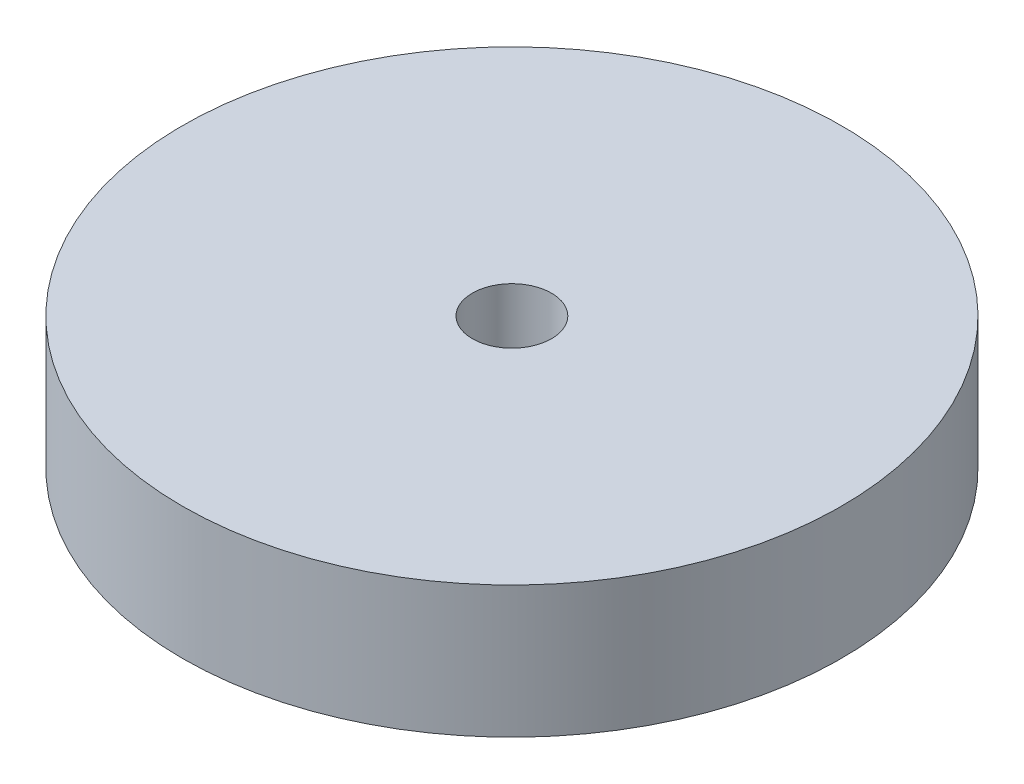
ISO-10303-21;
HEADER;
FILE_DESCRIPTION(('STEP AP214'),'2;1');
FILE_NAME('part.step','',(''),(''),'','','');
FILE_SCHEMA(('AUTOMOTIVE_DESIGN { 1 0 10303 214 1 1 1 1 }'));
ENDSEC;
DATA;
#1=APPLICATION_CONTEXT('core data for automotive mechanical design processes');
#2=APPLICATION_PROTOCOL_DEFINITION('international standard','automotive_design',2000,#1);
#3=PRODUCT_CONTEXT('',#1,'mechanical');
#4=PRODUCT('Part','Part','',(#3));
#5=PRODUCT_RELATED_PRODUCT_CATEGORY('part','',(#4));
#6=PRODUCT_DEFINITION_FORMATION('','',#4);
#7=PRODUCT_DEFINITION_CONTEXT('part definition',#1,'design');
#8=PRODUCT_DEFINITION('design','',#6,#7);
#9=PRODUCT_DEFINITION_SHAPE('','',#8);
#10=(LENGTH_UNIT() NAMED_UNIT(*) SI_UNIT(.MILLI.,.METRE.));
#11=(NAMED_UNIT(*) PLANE_ANGLE_UNIT() SI_UNIT($,.RADIAN.));
#12=(NAMED_UNIT(*) SI_UNIT($,.STERADIAN.) SOLID_ANGLE_UNIT());
#13=UNCERTAINTY_MEASURE_WITH_UNIT(LENGTH_MEASURE(1.E-05),#10,'distance_accuracy_value','');
#14=(GEOMETRIC_REPRESENTATION_CONTEXT(3) GLOBAL_UNCERTAINTY_ASSIGNED_CONTEXT((#13)) GLOBAL_UNIT_ASSIGNED_CONTEXT((#10,
#11,#12)) REPRESENTATION_CONTEXT('',''));
#15=CARTESIAN_POINT('',(0.,0.,0.));
#16=DIRECTION('',(0.,0.,1.));
#17=DIRECTION('',(1.,0.,0.));
#18=AXIS2_PLACEMENT_3D('',#15,#16,#17);
#19=CARTESIAN_POINT('',(0.,5.,0.));
#20=DIRECTION('',(0.,1.,0.));
#21=DIRECTION('',(0.,0.,1.));
#22=AXIS2_PLACEMENT_3D('',#19,#20,#21);
#23=PLANE('',#22);
#24=CARTESIAN_POINT('',(0.,5.,0.));
#25=DIRECTION('',(0.,1.,0.));
#26=DIRECTION('',(0.,0.,1.));
#27=AXIS2_PLACEMENT_3D('',#24,#25,#26);
#28=CIRCLE('',#27,25.);
#29=CARTESIAN_POINT('',(0.,5.,25.));
#30=VERTEX_POINT('',#29);
#31=EDGE_CURVE('E10',#30,#30,#28,.T.);
#32=ORIENTED_EDGE('',*,*,#31,.T.);
#33=EDGE_LOOP('',(#32));
#34=FACE_BOUND('',#33,.T.);
#35=CARTESIAN_POINT('',(0.,5.,0.));
#36=DIRECTION('',(0.,1.,0.));
#37=DIRECTION('',(0.,0.,1.));
#38=AXIS2_PLACEMENT_3D('',#35,#36,#37);
#39=CIRCLE('',#38,3.);
#40=CARTESIAN_POINT('',(0.,5.,3.));
#41=VERTEX_POINT('',#40);
#42=EDGE_CURVE('E46',#41,#41,#39,.T.);
#43=ORIENTED_EDGE('',*,*,#42,.F.);
#44=EDGE_LOOP('',(#43));
#45=FACE_BOUND('',#44,.T.);
#46=ADVANCED_FACE('F35',(#34,#45),#23,.T.);
#47=CARTESIAN_POINT('',(0.,-5.,0.));
#48=DIRECTION('',(0.,1.,0.));
#49=DIRECTION('',(0.,0.,1.));
#50=AXIS2_PLACEMENT_3D('',#47,#48,#49);
#51=PLANE('',#50);
#52=CARTESIAN_POINT('',(0.,-5.,0.));
#53=DIRECTION('',(0.,1.,0.));
#54=DIRECTION('',(0.,0.,1.));
#55=AXIS2_PLACEMENT_3D('',#52,#53,#54);
#56=CIRCLE('',#55,25.);
#57=CARTESIAN_POINT('',(0.,-5.,25.));
#58=VERTEX_POINT('',#57);
#59=EDGE_CURVE('E39',#58,#58,#56,.T.);
#60=ORIENTED_EDGE('',*,*,#59,.F.);
#61=EDGE_LOOP('',(#60));
#62=FACE_BOUND('',#61,.T.);
#63=CARTESIAN_POINT('',(0.,-5.,0.));
#64=DIRECTION('',(0.,1.,0.));
#65=DIRECTION('',(0.,0.,1.));
#66=AXIS2_PLACEMENT_3D('',#63,#64,#65);
#67=CIRCLE('',#66,3.);
#68=CARTESIAN_POINT('',(0.,-5.,3.));
#69=VERTEX_POINT('',#68);
#70=EDGE_CURVE('E48',#69,#69,#67,.T.);
#71=ORIENTED_EDGE('',*,*,#70,.T.);
#72=EDGE_LOOP('',(#71));
#73=FACE_BOUND('',#72,.T.);
#74=ADVANCED_FACE('F58',(#62,#73),#51,.F.);
#75=CARTESIAN_POINT('',(0.,5.,0.));
#76=DIRECTION('',(0.,-1.,0.));
#77=DIRECTION('',(0.,0.,-1.));
#78=AXIS2_PLACEMENT_3D('',#75,#76,#77);
#79=CYLINDRICAL_SURFACE('',#78,25.);
#80=ORIENTED_EDGE('',*,*,#31,.F.);
#81=EDGE_LOOP('',(#80));
#82=FACE_BOUND('',#81,.T.);
#83=ORIENTED_EDGE('',*,*,#59,.T.);
#84=EDGE_LOOP('',(#83));
#85=FACE_BOUND('',#84,.T.);
#86=ADVANCED_FACE('F37',(#82,#85),#79,.T.);
#87=CARTESIAN_POINT('',(0.,5.,0.));
#88=DIRECTION('',(0.,-1.,0.));
#89=DIRECTION('',(0.,0.,-1.));
#90=AXIS2_PLACEMENT_3D('',#87,#88,#89);
#91=CYLINDRICAL_SURFACE('',#90,3.);
#92=ORIENTED_EDGE('',*,*,#42,.T.);
#93=EDGE_LOOP('',(#92));
#94=FACE_BOUND('',#93,.T.);
#95=ORIENTED_EDGE('',*,*,#70,.F.);
#96=EDGE_LOOP('',(#95));
#97=FACE_BOUND('',#96,.T.);
#98=ADVANCED_FACE('F54',(#94,#97),#91,.F.);
#99=CLOSED_SHELL('',(#46,#74,#86,#98));
#100=MANIFOLD_SOLID_BREP('B2',#99);
#101=ADVANCED_BREP_SHAPE_REPRESENTATION('',(#18,#100),#14);
#102=SHAPE_DEFINITION_REPRESENTATION(#9,#101);
ENDSEC;
END-ISO-10303-21;
